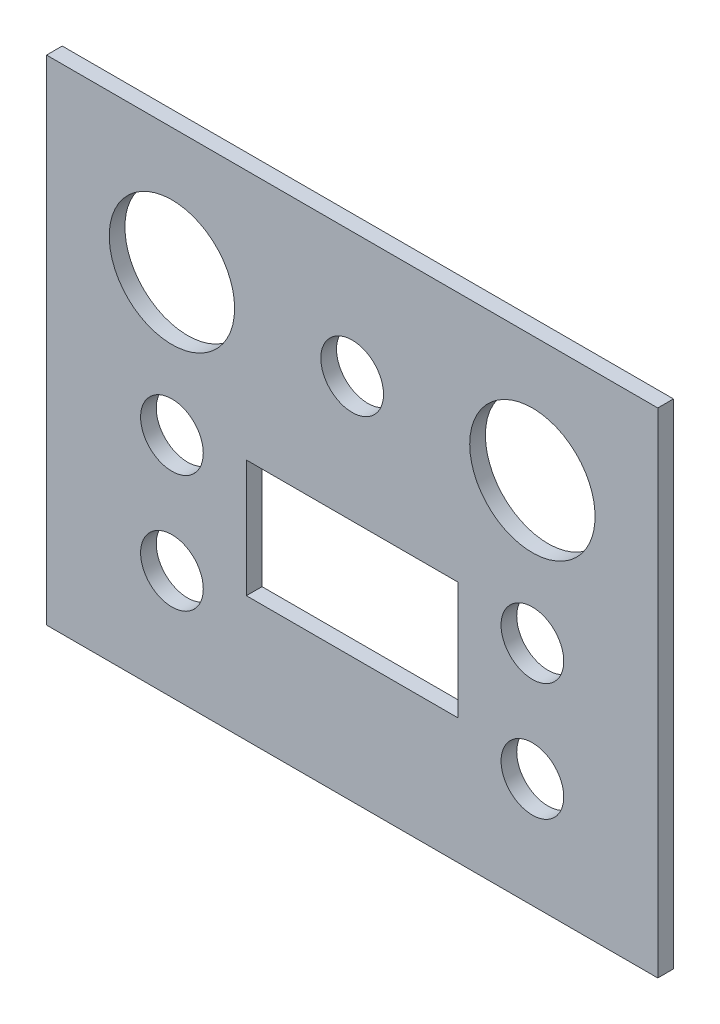
ISO-10303-21;
HEADER;
FILE_DESCRIPTION(('STEP AP214'),'2;1');
FILE_NAME('part.step','',(''),(''),'','','');
FILE_SCHEMA(('AUTOMOTIVE_DESIGN { 1 0 10303 214 1 1 1 1 }'));
ENDSEC;
DATA;
#1=APPLICATION_CONTEXT('core data for automotive mechanical design processes');
#2=APPLICATION_PROTOCOL_DEFINITION('international standard','automotive_design',2000,#1);
#3=PRODUCT_CONTEXT('',#1,'mechanical');
#4=PRODUCT('Part','Part','',(#3));
#5=PRODUCT_RELATED_PRODUCT_CATEGORY('part','',(#4));
#6=PRODUCT_DEFINITION_FORMATION('','',#4);
#7=PRODUCT_DEFINITION_CONTEXT('part definition',#1,'design');
#8=PRODUCT_DEFINITION('design','',#6,#7);
#9=PRODUCT_DEFINITION_SHAPE('','',#8);
#10=(LENGTH_UNIT() NAMED_UNIT(*) SI_UNIT(.MILLI.,.METRE.));
#11=(NAMED_UNIT(*) PLANE_ANGLE_UNIT() SI_UNIT($,.RADIAN.));
#12=(NAMED_UNIT(*) SI_UNIT($,.STERADIAN.) SOLID_ANGLE_UNIT());
#13=UNCERTAINTY_MEASURE_WITH_UNIT(LENGTH_MEASURE(1.E-05),#10,'distance_accuracy_value','');
#14=(GEOMETRIC_REPRESENTATION_CONTEXT(3) GLOBAL_UNCERTAINTY_ASSIGNED_CONTEXT((#13)) GLOBAL_UNIT_ASSIGNED_CONTEXT((#10,
#11,#12)) REPRESENTATION_CONTEXT('',''));
#15=CARTESIAN_POINT('',(0.,0.,0.));
#16=DIRECTION('',(0.,0.,1.));
#17=DIRECTION('',(1.,0.,0.));
#18=AXIS2_PLACEMENT_3D('',#15,#16,#17);
#19=CARTESIAN_POINT('',(0.,0.,2.));
#20=DIRECTION('',(0.,0.,-1.));
#21=DIRECTION('',(-1.,0.,0.));
#22=AXIS2_PLACEMENT_3D('',#19,#20,#21);
#23=PLANE('',#22);
#24=DIRECTION('',(0.,1.,0.));
#25=VECTOR('',#24,1.);
#26=CARTESIAN_POINT('',(39.,-31.5,2.));
#27=LINE('',#26,#25);
#28=CARTESIAN_POINT('',(39.,-31.5,2.));
#29=VERTEX_POINT('',#28);
#30=CARTESIAN_POINT('',(39.,31.5,2.));
#31=VERTEX_POINT('',#30);
#32=EDGE_CURVE('E143',#29,#31,#27,.T.);
#33=ORIENTED_EDGE('',*,*,#32,.T.);
#34=DIRECTION('',(-1.,0.,0.));
#35=VECTOR('',#34,1.);
#36=CARTESIAN_POINT('',(-39.,31.5,2.));
#37=LINE('',#36,#35);
#38=CARTESIAN_POINT('',(-39.,31.5,2.));
#39=VERTEX_POINT('',#38);
#40=EDGE_CURVE('E146',#31,#39,#37,.T.);
#41=ORIENTED_EDGE('',*,*,#40,.T.);
#42=DIRECTION('',(0.,-1.,0.));
#43=VECTOR('',#42,1.);
#44=CARTESIAN_POINT('',(-39.,-31.5,2.));
#45=LINE('',#44,#43);
#46=CARTESIAN_POINT('',(-39.,-31.5,2.));
#47=VERTEX_POINT('',#46);
#48=EDGE_CURVE('E149',#39,#47,#45,.T.);
#49=ORIENTED_EDGE('',*,*,#48,.T.);
#50=DIRECTION('',(1.,0.,0.));
#51=VECTOR('',#50,1.);
#52=CARTESIAN_POINT('',(-39.,-31.5,2.));
#53=LINE('',#52,#51);
#54=EDGE_CURVE('E151',#47,#29,#53,.T.);
#55=ORIENTED_EDGE('',*,*,#54,.T.);
#56=EDGE_LOOP('',(#33,#41,#49,#55));
#57=FACE_BOUND('',#56,.T.);
#58=DIRECTION('',(0.,-1.,0.));
#59=VECTOR('',#58,1.);
#60=CARTESIAN_POINT('',(-13.5,-0.5,2.));
#61=LINE('',#60,#59);
#62=CARTESIAN_POINT('',(-13.5,-0.5,2.));
#63=VERTEX_POINT('',#62);
#64=CARTESIAN_POINT('',(-13.5,-15.5,2.));
#65=VERTEX_POINT('',#64);
#66=EDGE_CURVE('E104',#63,#65,#61,.T.);
#67=ORIENTED_EDGE('',*,*,#66,.F.);
#68=DIRECTION('',(-1.,0.,0.));
#69=VECTOR('',#68,1.);
#70=CARTESIAN_POINT('',(-13.5,-0.5,2.));
#71=LINE('',#70,#69);
#72=CARTESIAN_POINT('',(13.5,-0.500000000000002,2.));
#73=VERTEX_POINT('',#72);
#74=EDGE_CURVE('E127',#73,#63,#71,.T.);
#75=ORIENTED_EDGE('',*,*,#74,.F.);
#76=DIRECTION('',(0.,1.,0.));
#77=VECTOR('',#76,1.);
#78=CARTESIAN_POINT('',(13.5,-0.500000000000002,2.));
#79=LINE('',#78,#77);
#80=CARTESIAN_POINT('',(13.5,-15.5,2.));
#81=VERTEX_POINT('',#80);
#82=EDGE_CURVE('E125',#81,#73,#79,.T.);
#83=ORIENTED_EDGE('',*,*,#82,.F.);
#84=DIRECTION('',(1.,0.,0.));
#85=VECTOR('',#84,1.);
#86=CARTESIAN_POINT('',(-13.5,-15.5,2.));
#87=LINE('',#86,#85);
#88=EDGE_CURVE('E112',#65,#81,#87,.T.);
#89=ORIENTED_EDGE('',*,*,#88,.F.);
#90=EDGE_LOOP('',(#67,#75,#83,#89));
#91=FACE_BOUND('',#90,.T.);
#92=CARTESIAN_POINT('',(0.,15.5,2.));
#93=DIRECTION('',(0.,0.,1.));
#94=DIRECTION('',(1.,0.,0.));
#95=AXIS2_PLACEMENT_3D('',#92,#93,#94);
#96=CIRCLE('',#95,4.);
#97=CARTESIAN_POINT('',(4.,15.5,2.));
#98=VERTEX_POINT('',#97);
#99=EDGE_CURVE('E133',#98,#98,#96,.T.);
#100=ORIENTED_EDGE('',*,*,#99,.F.);
#101=EDGE_LOOP('',(#100));
#102=FACE_BOUND('',#101,.T.);
#103=CARTESIAN_POINT('',(-23.,-17.5,2.));
#104=DIRECTION('',(0.,0.,1.));
#105=DIRECTION('',(1.,0.,0.));
#106=AXIS2_PLACEMENT_3D('',#103,#104,#105);
#107=CIRCLE('',#106,4.);
#108=CARTESIAN_POINT('',(-19.,-17.5,2.));
#109=VERTEX_POINT('',#108);
#110=EDGE_CURVE('E285',#109,#109,#107,.T.);
#111=ORIENTED_EDGE('',*,*,#110,.F.);
#112=EDGE_LOOP('',(#111));
#113=FACE_BOUND('',#112,.T.);
#114=CARTESIAN_POINT('',(23.,15.5,2.));
#115=DIRECTION('',(0.,0.,1.));
#116=DIRECTION('',(-1.,0.,0.));
#117=AXIS2_PLACEMENT_3D('',#114,#115,#116);
#118=CIRCLE('',#117,8.);
#119=CARTESIAN_POINT('',(15.,15.5,2.));
#120=VERTEX_POINT('',#119);
#121=EDGE_CURVE('E279',#120,#120,#118,.T.);
#122=ORIENTED_EDGE('',*,*,#121,.F.);
#123=EDGE_LOOP('',(#122));
#124=FACE_BOUND('',#123,.T.);
#125=CARTESIAN_POINT('',(23.,-2.5,2.));
#126=DIRECTION('',(0.,0.,1.));
#127=DIRECTION('',(-1.,0.,0.));
#128=AXIS2_PLACEMENT_3D('',#125,#126,#127);
#129=CIRCLE('',#128,4.);
#130=CARTESIAN_POINT('',(19.,-2.5,2.));
#131=VERTEX_POINT('',#130);
#132=EDGE_CURVE('E273',#131,#131,#129,.T.);
#133=ORIENTED_EDGE('',*,*,#132,.F.);
#134=EDGE_LOOP('',(#133));
#135=FACE_BOUND('',#134,.T.);
#136=CARTESIAN_POINT('',(-23.,-2.50000000000001,2.));
#137=DIRECTION('',(0.,0.,1.));
#138=DIRECTION('',(1.,0.,0.));
#139=AXIS2_PLACEMENT_3D('',#136,#137,#138);
#140=CIRCLE('',#139,4.);
#141=CARTESIAN_POINT('',(-19.,-2.50000000000001,2.));
#142=VERTEX_POINT('',#141);
#143=EDGE_CURVE('E267',#142,#142,#140,.T.);
#144=ORIENTED_EDGE('',*,*,#143,.F.);
#145=EDGE_LOOP('',(#144));
#146=FACE_BOUND('',#145,.T.);
#147=CARTESIAN_POINT('',(-23.,15.5,2.));
#148=DIRECTION('',(0.,0.,1.));
#149=DIRECTION('',(1.,0.,0.));
#150=AXIS2_PLACEMENT_3D('',#147,#148,#149);
#151=CIRCLE('',#150,8.);
#152=CARTESIAN_POINT('',(-15.,15.5,2.));
#153=VERTEX_POINT('',#152);
#154=EDGE_CURVE('E261',#153,#153,#151,.T.);
#155=ORIENTED_EDGE('',*,*,#154,.F.);
#156=EDGE_LOOP('',(#155));
#157=FACE_BOUND('',#156,.T.);
#158=CARTESIAN_POINT('',(23.,-17.5,2.));
#159=DIRECTION('',(0.,0.,1.));
#160=DIRECTION('',(-1.,0.,0.));
#161=AXIS2_PLACEMENT_3D('',#158,#159,#160);
#162=CIRCLE('',#161,4.);
#163=CARTESIAN_POINT('',(19.,-17.5,2.));
#164=VERTEX_POINT('',#163);
#165=EDGE_CURVE('E252',#164,#164,#162,.T.);
#166=ORIENTED_EDGE('',*,*,#165,.F.);
#167=EDGE_LOOP('',(#166));
#168=FACE_BOUND('',#167,.T.);
#169=ADVANCED_FACE('F39',(#57,#91,#102,#113,#124,#135,#146,#157,#168),#23,.F.);
#170=CARTESIAN_POINT('',(0.,0.,0.));
#171=DIRECTION('',(0.,0.,-1.));
#172=DIRECTION('',(-1.,0.,0.));
#173=AXIS2_PLACEMENT_3D('',#170,#171,#172);
#174=PLANE('',#173);
#175=CARTESIAN_POINT('',(-23.,15.5,0.));
#176=DIRECTION('',(0.,0.,1.));
#177=DIRECTION('',(1.,0.,0.));
#178=AXIS2_PLACEMENT_3D('',#175,#176,#177);
#179=CIRCLE('',#178,8.);
#180=CARTESIAN_POINT('',(-15.,15.5,0.));
#181=VERTEX_POINT('',#180);
#182=EDGE_CURVE('E258',#181,#181,#179,.T.);
#183=ORIENTED_EDGE('',*,*,#182,.T.);
#184=EDGE_LOOP('',(#183));
#185=FACE_BOUND('',#184,.T.);
#186=CARTESIAN_POINT('',(23.,-2.5,0.));
#187=DIRECTION('',(0.,0.,1.));
#188=DIRECTION('',(-1.,0.,0.));
#189=AXIS2_PLACEMENT_3D('',#186,#187,#188);
#190=CIRCLE('',#189,4.);
#191=CARTESIAN_POINT('',(19.,-2.5,0.));
#192=VERTEX_POINT('',#191);
#193=EDGE_CURVE('E270',#192,#192,#190,.T.);
#194=ORIENTED_EDGE('',*,*,#193,.T.);
#195=EDGE_LOOP('',(#194));
#196=FACE_BOUND('',#195,.T.);
#197=CARTESIAN_POINT('',(-23.,-17.5,0.));
#198=DIRECTION('',(0.,0.,1.));
#199=DIRECTION('',(1.,0.,0.));
#200=AXIS2_PLACEMENT_3D('',#197,#198,#199);
#201=CIRCLE('',#200,4.);
#202=CARTESIAN_POINT('',(-19.,-17.5,0.));
#203=VERTEX_POINT('',#202);
#204=EDGE_CURVE('E282',#203,#203,#201,.T.);
#205=ORIENTED_EDGE('',*,*,#204,.T.);
#206=EDGE_LOOP('',(#205));
#207=FACE_BOUND('',#206,.T.);
#208=DIRECTION('',(-1.,0.,0.));
#209=VECTOR('',#208,1.);
#210=CARTESIAN_POINT('',(-13.5,-0.5,0.));
#211=LINE('',#210,#209);
#212=CARTESIAN_POINT('',(13.5,-0.500000000000002,0.));
#213=VERTEX_POINT('',#212);
#214=CARTESIAN_POINT('',(-13.5,-0.5,0.));
#215=VERTEX_POINT('',#214);
#216=EDGE_CURVE('E113',#213,#215,#211,.T.);
#217=ORIENTED_EDGE('',*,*,#216,.T.);
#218=DIRECTION('',(0.,-1.,0.));
#219=VECTOR('',#218,1.);
#220=CARTESIAN_POINT('',(-13.5,-0.5,0.));
#221=LINE('',#220,#219);
#222=CARTESIAN_POINT('',(-13.5,-15.5,0.));
#223=VERTEX_POINT('',#222);
#224=EDGE_CURVE('E62',#215,#223,#221,.T.);
#225=ORIENTED_EDGE('',*,*,#224,.T.);
#226=DIRECTION('',(1.,0.,0.));
#227=VECTOR('',#226,1.);
#228=CARTESIAN_POINT('',(-13.5,-15.5,0.));
#229=LINE('',#228,#227);
#230=CARTESIAN_POINT('',(13.5,-15.5,0.));
#231=VERTEX_POINT('',#230);
#232=EDGE_CURVE('E119',#223,#231,#229,.T.);
#233=ORIENTED_EDGE('',*,*,#232,.T.);
#234=DIRECTION('',(0.,1.,0.));
#235=VECTOR('',#234,1.);
#236=CARTESIAN_POINT('',(13.5,-0.500000000000002,0.));
#237=LINE('',#236,#235);
#238=EDGE_CURVE('E135',#231,#213,#237,.T.);
#239=ORIENTED_EDGE('',*,*,#238,.T.);
#240=EDGE_LOOP('',(#217,#225,#233,#239));
#241=FACE_BOUND('',#240,.T.);
#242=DIRECTION('',(0.,1.,0.));
#243=VECTOR('',#242,1.);
#244=CARTESIAN_POINT('',(39.,-31.5,0.));
#245=LINE('',#244,#243);
#246=CARTESIAN_POINT('',(39.,-31.5,0.));
#247=VERTEX_POINT('',#246);
#248=CARTESIAN_POINT('',(39.,31.5,0.));
#249=VERTEX_POINT('',#248);
#250=EDGE_CURVE('E120',#247,#249,#245,.T.);
#251=ORIENTED_EDGE('',*,*,#250,.F.);
#252=DIRECTION('',(1.,0.,0.));
#253=VECTOR('',#252,1.);
#254=CARTESIAN_POINT('',(-39.,-31.5,0.));
#255=LINE('',#254,#253);
#256=CARTESIAN_POINT('',(-39.,-31.5,0.));
#257=VERTEX_POINT('',#256);
#258=EDGE_CURVE('E147',#257,#247,#255,.T.);
#259=ORIENTED_EDGE('',*,*,#258,.F.);
#260=DIRECTION('',(0.,-1.,0.));
#261=VECTOR('',#260,1.);
#262=CARTESIAN_POINT('',(-39.,-31.5,0.));
#263=LINE('',#262,#261);
#264=CARTESIAN_POINT('',(-39.,31.5,0.));
#265=VERTEX_POINT('',#264);
#266=EDGE_CURVE('E158',#265,#257,#263,.T.);
#267=ORIENTED_EDGE('',*,*,#266,.F.);
#268=DIRECTION('',(-1.,0.,0.));
#269=VECTOR('',#268,1.);
#270=CARTESIAN_POINT('',(-39.,31.5,0.));
#271=LINE('',#270,#269);
#272=EDGE_CURVE('E156',#249,#265,#271,.T.);
#273=ORIENTED_EDGE('',*,*,#272,.F.);
#274=EDGE_LOOP('',(#251,#259,#267,#273));
#275=FACE_BOUND('',#274,.T.);
#276=CARTESIAN_POINT('',(0.,15.5,0.));
#277=DIRECTION('',(0.,0.,1.));
#278=DIRECTION('',(1.,0.,0.));
#279=AXIS2_PLACEMENT_3D('',#276,#277,#278);
#280=CIRCLE('',#279,4.);
#281=CARTESIAN_POINT('',(4.,15.5,0.));
#282=VERTEX_POINT('',#281);
#283=EDGE_CURVE('E288',#282,#282,#280,.T.);
#284=ORIENTED_EDGE('',*,*,#283,.T.);
#285=EDGE_LOOP('',(#284));
#286=FACE_BOUND('',#285,.T.);
#287=CARTESIAN_POINT('',(23.,15.5,0.));
#288=DIRECTION('',(0.,0.,1.));
#289=DIRECTION('',(-1.,0.,0.));
#290=AXIS2_PLACEMENT_3D('',#287,#288,#289);
#291=CIRCLE('',#290,8.);
#292=CARTESIAN_POINT('',(15.,15.5,0.));
#293=VERTEX_POINT('',#292);
#294=EDGE_CURVE('E276',#293,#293,#291,.T.);
#295=ORIENTED_EDGE('',*,*,#294,.T.);
#296=EDGE_LOOP('',(#295));
#297=FACE_BOUND('',#296,.T.);
#298=CARTESIAN_POINT('',(-23.,-2.50000000000001,0.));
#299=DIRECTION('',(0.,0.,1.));
#300=DIRECTION('',(1.,0.,0.));
#301=AXIS2_PLACEMENT_3D('',#298,#299,#300);
#302=CIRCLE('',#301,4.);
#303=CARTESIAN_POINT('',(-19.,-2.50000000000001,0.));
#304=VERTEX_POINT('',#303);
#305=EDGE_CURVE('E264',#304,#304,#302,.T.);
#306=ORIENTED_EDGE('',*,*,#305,.T.);
#307=EDGE_LOOP('',(#306));
#308=FACE_BOUND('',#307,.T.);
#309=CARTESIAN_POINT('',(23.,-17.5,0.));
#310=DIRECTION('',(0.,0.,1.));
#311=DIRECTION('',(-1.,0.,0.));
#312=AXIS2_PLACEMENT_3D('',#309,#310,#311);
#313=CIRCLE('',#312,4.);
#314=CARTESIAN_POINT('',(19.,-17.5,0.));
#315=VERTEX_POINT('',#314);
#316=EDGE_CURVE('E255',#315,#315,#313,.T.);
#317=ORIENTED_EDGE('',*,*,#316,.T.);
#318=EDGE_LOOP('',(#317));
#319=FACE_BOUND('',#318,.T.);
#320=ADVANCED_FACE('F176',(#185,#196,#207,#241,#275,#286,#297,#308,#319),#174,.T.);
#321=CARTESIAN_POINT('',(39.,-31.5,2.));
#322=DIRECTION('',(-1.,0.,0.));
#323=DIRECTION('',(0.,0.,1.));
#324=AXIS2_PLACEMENT_3D('',#321,#322,#323);
#325=PLANE('',#324);
#326=ORIENTED_EDGE('',*,*,#250,.T.);
#327=DIRECTION('',(0.,0.,-1.));
#328=VECTOR('',#327,1.);
#329=CARTESIAN_POINT('',(39.,31.5,2.));
#330=LINE('',#329,#328);
#331=EDGE_CURVE('E11',#31,#249,#330,.T.);
#332=ORIENTED_EDGE('',*,*,#331,.F.);
#333=ORIENTED_EDGE('',*,*,#32,.F.);
#334=DIRECTION('',(0.,0.,-1.));
#335=VECTOR('',#334,1.);
#336=CARTESIAN_POINT('',(39.,-31.5,2.));
#337=LINE('',#336,#335);
#338=EDGE_CURVE('E153',#29,#247,#337,.T.);
#339=ORIENTED_EDGE('',*,*,#338,.T.);
#340=EDGE_LOOP('',(#326,#332,#333,#339));
#341=FACE_BOUND('',#340,.T.);
#342=ADVANCED_FACE('F41',(#341),#325,.F.);
#343=CARTESIAN_POINT('',(-39.,31.5,2.));
#344=DIRECTION('',(0.,-1.,0.));
#345=DIRECTION('',(0.,0.,-1.));
#346=AXIS2_PLACEMENT_3D('',#343,#344,#345);
#347=PLANE('',#346);
#348=ORIENTED_EDGE('',*,*,#272,.T.);
#349=DIRECTION('',(0.,0.,-1.));
#350=VECTOR('',#349,1.);
#351=CARTESIAN_POINT('',(-39.,31.5,2.));
#352=LINE('',#351,#350);
#353=EDGE_CURVE('E47',#39,#265,#352,.T.);
#354=ORIENTED_EDGE('',*,*,#353,.F.);
#355=ORIENTED_EDGE('',*,*,#40,.F.);
#356=ORIENTED_EDGE('',*,*,#331,.T.);
#357=EDGE_LOOP('',(#348,#354,#355,#356));
#358=FACE_BOUND('',#357,.T.);
#359=ADVANCED_FACE('F186',(#358),#347,.F.);
#360=CARTESIAN_POINT('',(-39.,-31.5,2.));
#361=DIRECTION('',(1.,0.,0.));
#362=DIRECTION('',(0.,1.,0.));
#363=AXIS2_PLACEMENT_3D('',#360,#361,#362);
#364=PLANE('',#363);
#365=ORIENTED_EDGE('',*,*,#266,.T.);
#366=DIRECTION('',(0.,0.,-1.));
#367=VECTOR('',#366,1.);
#368=CARTESIAN_POINT('',(-39.,-31.5,2.));
#369=LINE('',#368,#367);
#370=EDGE_CURVE('E163',#47,#257,#369,.T.);
#371=ORIENTED_EDGE('',*,*,#370,.F.);
#372=ORIENTED_EDGE('',*,*,#48,.F.);
#373=ORIENTED_EDGE('',*,*,#353,.T.);
#374=EDGE_LOOP('',(#365,#371,#372,#373));
#375=FACE_BOUND('',#374,.T.);
#376=ADVANCED_FACE('F170',(#375),#364,.F.);
#377=CARTESIAN_POINT('',(-39.,-31.5,2.));
#378=DIRECTION('',(0.,1.,0.));
#379=DIRECTION('',(0.,0.,1.));
#380=AXIS2_PLACEMENT_3D('',#377,#378,#379);
#381=PLANE('',#380);
#382=ORIENTED_EDGE('',*,*,#258,.T.);
#383=ORIENTED_EDGE('',*,*,#338,.F.);
#384=ORIENTED_EDGE('',*,*,#54,.F.);
#385=ORIENTED_EDGE('',*,*,#370,.T.);
#386=EDGE_LOOP('',(#382,#383,#384,#385));
#387=FACE_BOUND('',#386,.T.);
#388=ADVANCED_FACE('F180',(#387),#381,.F.);
#389=CARTESIAN_POINT('',(-13.5,-0.5,2.));
#390=DIRECTION('',(1.,0.,0.));
#391=DIRECTION('',(0.,0.,-1.));
#392=AXIS2_PLACEMENT_3D('',#389,#390,#391);
#393=PLANE('',#392);
#394=ORIENTED_EDGE('',*,*,#224,.F.);
#395=DIRECTION('',(0.,0.,-1.));
#396=VECTOR('',#395,1.);
#397=CARTESIAN_POINT('',(-13.5,-0.5,2.));
#398=LINE('',#397,#396);
#399=EDGE_CURVE('E108',#63,#215,#398,.T.);
#400=ORIENTED_EDGE('',*,*,#399,.F.);
#401=ORIENTED_EDGE('',*,*,#66,.T.);
#402=DIRECTION('',(0.,0.,-1.));
#403=VECTOR('',#402,1.);
#404=CARTESIAN_POINT('',(-13.5,-15.5,2.));
#405=LINE('',#404,#403);
#406=EDGE_CURVE('E107',#65,#223,#405,.T.);
#407=ORIENTED_EDGE('',*,*,#406,.T.);
#408=EDGE_LOOP('',(#394,#400,#401,#407));
#409=FACE_BOUND('',#408,.T.);
#410=ADVANCED_FACE('F106',(#409),#393,.T.);
#411=CARTESIAN_POINT('',(-13.5,-15.5,2.));
#412=DIRECTION('',(0.,1.,0.));
#413=DIRECTION('',(0.,0.,1.));
#414=AXIS2_PLACEMENT_3D('',#411,#412,#413);
#415=PLANE('',#414);
#416=ORIENTED_EDGE('',*,*,#232,.F.);
#417=ORIENTED_EDGE('',*,*,#406,.F.);
#418=ORIENTED_EDGE('',*,*,#88,.T.);
#419=DIRECTION('',(0.,0.,-1.));
#420=VECTOR('',#419,1.);
#421=CARTESIAN_POINT('',(13.5,-15.5,2.));
#422=LINE('',#421,#420);
#423=EDGE_CURVE('E121',#81,#231,#422,.T.);
#424=ORIENTED_EDGE('',*,*,#423,.T.);
#425=EDGE_LOOP('',(#416,#417,#418,#424));
#426=FACE_BOUND('',#425,.T.);
#427=ADVANCED_FACE('F116',(#426),#415,.T.);
#428=CARTESIAN_POINT('',(13.5,-0.500000000000002,2.));
#429=DIRECTION('',(-1.,0.,0.));
#430=DIRECTION('',(0.,0.,1.));
#431=AXIS2_PLACEMENT_3D('',#428,#429,#430);
#432=PLANE('',#431);
#433=ORIENTED_EDGE('',*,*,#238,.F.);
#434=ORIENTED_EDGE('',*,*,#423,.F.);
#435=ORIENTED_EDGE('',*,*,#82,.T.);
#436=DIRECTION('',(0.,0.,-1.));
#437=VECTOR('',#436,1.);
#438=CARTESIAN_POINT('',(13.5,-0.500000000000002,2.));
#439=LINE('',#438,#437);
#440=EDGE_CURVE('E54',#73,#213,#439,.T.);
#441=ORIENTED_EDGE('',*,*,#440,.T.);
#442=EDGE_LOOP('',(#433,#434,#435,#441));
#443=FACE_BOUND('',#442,.T.);
#444=ADVANCED_FACE('F210',(#443),#432,.T.);
#445=CARTESIAN_POINT('',(-13.5,-0.5,2.));
#446=DIRECTION('',(0.,-1.,0.));
#447=DIRECTION('',(1.,0.,0.));
#448=AXIS2_PLACEMENT_3D('',#445,#446,#447);
#449=PLANE('',#448);
#450=ORIENTED_EDGE('',*,*,#216,.F.);
#451=ORIENTED_EDGE('',*,*,#440,.F.);
#452=ORIENTED_EDGE('',*,*,#74,.T.);
#453=ORIENTED_EDGE('',*,*,#399,.T.);
#454=EDGE_LOOP('',(#450,#451,#452,#453));
#455=FACE_BOUND('',#454,.T.);
#456=ADVANCED_FACE('F214',(#455),#449,.T.);
#457=CARTESIAN_POINT('',(0.,15.5,2.));
#458=DIRECTION('',(0.,0.,-1.));
#459=DIRECTION('',(-1.,0.,0.));
#460=AXIS2_PLACEMENT_3D('',#457,#458,#459);
#461=CYLINDRICAL_SURFACE('',#460,4.);
#462=ORIENTED_EDGE('',*,*,#99,.T.);
#463=EDGE_LOOP('',(#462));
#464=FACE_BOUND('',#463,.T.);
#465=ORIENTED_EDGE('',*,*,#283,.F.);
#466=EDGE_LOOP('',(#465));
#467=FACE_BOUND('',#466,.T.);
#468=ADVANCED_FACE('F220',(#464,#467),#461,.F.);
#469=CARTESIAN_POINT('',(-23.,-17.5,2.));
#470=DIRECTION('',(0.,0.,-1.));
#471=DIRECTION('',(-1.,0.,0.));
#472=AXIS2_PLACEMENT_3D('',#469,#470,#471);
#473=CYLINDRICAL_SURFACE('',#472,4.);
#474=ORIENTED_EDGE('',*,*,#110,.T.);
#475=EDGE_LOOP('',(#474));
#476=FACE_BOUND('',#475,.T.);
#477=ORIENTED_EDGE('',*,*,#204,.F.);
#478=EDGE_LOOP('',(#477));
#479=FACE_BOUND('',#478,.T.);
#480=ADVANCED_FACE('F223',(#476,#479),#473,.F.);
#481=CARTESIAN_POINT('',(23.,15.5,2.));
#482=DIRECTION('',(0.,0.,-1.));
#483=DIRECTION('',(-1.,0.,0.));
#484=AXIS2_PLACEMENT_3D('',#481,#482,#483);
#485=CYLINDRICAL_SURFACE('',#484,8.);
#486=ORIENTED_EDGE('',*,*,#121,.T.);
#487=EDGE_LOOP('',(#486));
#488=FACE_BOUND('',#487,.T.);
#489=ORIENTED_EDGE('',*,*,#294,.F.);
#490=EDGE_LOOP('',(#489));
#491=FACE_BOUND('',#490,.T.);
#492=ADVANCED_FACE('F227',(#488,#491),#485,.F.);
#493=CARTESIAN_POINT('',(23.,-2.5,2.));
#494=DIRECTION('',(0.,0.,-1.));
#495=DIRECTION('',(-1.,0.,0.));
#496=AXIS2_PLACEMENT_3D('',#493,#494,#495);
#497=CYLINDRICAL_SURFACE('',#496,4.);
#498=ORIENTED_EDGE('',*,*,#132,.T.);
#499=EDGE_LOOP('',(#498));
#500=FACE_BOUND('',#499,.T.);
#501=ORIENTED_EDGE('',*,*,#193,.F.);
#502=EDGE_LOOP('',(#501));
#503=FACE_BOUND('',#502,.T.);
#504=ADVANCED_FACE('F231',(#500,#503),#497,.F.);
#505=CARTESIAN_POINT('',(-23.,-2.50000000000001,2.));
#506=DIRECTION('',(0.,0.,-1.));
#507=DIRECTION('',(-1.,0.,0.));
#508=AXIS2_PLACEMENT_3D('',#505,#506,#507);
#509=CYLINDRICAL_SURFACE('',#508,4.);
#510=ORIENTED_EDGE('',*,*,#143,.T.);
#511=EDGE_LOOP('',(#510));
#512=FACE_BOUND('',#511,.T.);
#513=ORIENTED_EDGE('',*,*,#305,.F.);
#514=EDGE_LOOP('',(#513));
#515=FACE_BOUND('',#514,.T.);
#516=ADVANCED_FACE('F235',(#512,#515),#509,.F.);
#517=CARTESIAN_POINT('',(-23.,15.5,2.));
#518=DIRECTION('',(0.,0.,-1.));
#519=DIRECTION('',(-1.,0.,0.));
#520=AXIS2_PLACEMENT_3D('',#517,#518,#519);
#521=CYLINDRICAL_SURFACE('',#520,8.);
#522=ORIENTED_EDGE('',*,*,#154,.T.);
#523=EDGE_LOOP('',(#522));
#524=FACE_BOUND('',#523,.T.);
#525=ORIENTED_EDGE('',*,*,#182,.F.);
#526=EDGE_LOOP('',(#525));
#527=FACE_BOUND('',#526,.T.);
#528=ADVANCED_FACE('F239',(#524,#527),#521,.F.);
#529=CARTESIAN_POINT('',(23.,-17.5,2.));
#530=DIRECTION('',(0.,0.,-1.));
#531=DIRECTION('',(-1.,0.,0.));
#532=AXIS2_PLACEMENT_3D('',#529,#530,#531);
#533=CYLINDRICAL_SURFACE('',#532,4.);
#534=ORIENTED_EDGE('',*,*,#165,.T.);
#535=EDGE_LOOP('',(#534));
#536=FACE_BOUND('',#535,.T.);
#537=ORIENTED_EDGE('',*,*,#316,.F.);
#538=EDGE_LOOP('',(#537));
#539=FACE_BOUND('',#538,.T.);
#540=ADVANCED_FACE('F243',(#536,#539),#533,.F.);
#541=CLOSED_SHELL('',(#169,#320,#342,#359,#376,#388,#410,#427,#444,#456,#468,#480,#492,#504,
#516,#528,#540));
#542=MANIFOLD_SOLID_BREP('B2',#541);
#543=ADVANCED_BREP_SHAPE_REPRESENTATION('',(#18,#542),#14);
#544=SHAPE_DEFINITION_REPRESENTATION(#9,#543);
ENDSEC;
END-ISO-10303-21;
